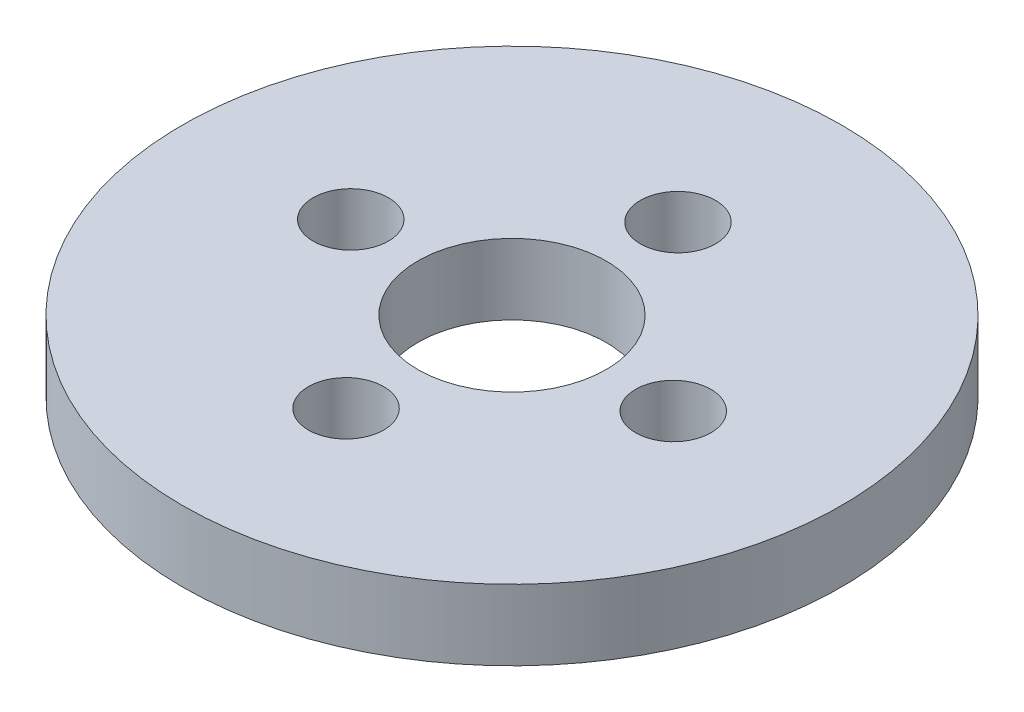
ISO-10303-21;
HEADER;
FILE_DESCRIPTION(('STEP AP214'),'2;1');
FILE_NAME('part.step','',(''),(''),'','','');
FILE_SCHEMA(('AUTOMOTIVE_DESIGN { 1 0 10303 214 1 1 1 1 }'));
ENDSEC;
DATA;
#1=APPLICATION_CONTEXT('core data for automotive mechanical design processes');
#2=APPLICATION_PROTOCOL_DEFINITION('international standard','automotive_design',2000,#1);
#3=PRODUCT_CONTEXT('',#1,'mechanical');
#4=PRODUCT('Part','Part','',(#3));
#5=PRODUCT_RELATED_PRODUCT_CATEGORY('part','',(#4));
#6=PRODUCT_DEFINITION_FORMATION('','',#4);
#7=PRODUCT_DEFINITION_CONTEXT('part definition',#1,'design');
#8=PRODUCT_DEFINITION('design','',#6,#7);
#9=PRODUCT_DEFINITION_SHAPE('','',#8);
#10=(LENGTH_UNIT() NAMED_UNIT(*) SI_UNIT(.MILLI.,.METRE.));
#11=(NAMED_UNIT(*) PLANE_ANGLE_UNIT() SI_UNIT($,.RADIAN.));
#12=(NAMED_UNIT(*) SI_UNIT($,.STERADIAN.) SOLID_ANGLE_UNIT());
#13=UNCERTAINTY_MEASURE_WITH_UNIT(LENGTH_MEASURE(1.E-05),#10,'distance_accuracy_value','');
#14=(GEOMETRIC_REPRESENTATION_CONTEXT(3) GLOBAL_UNCERTAINTY_ASSIGNED_CONTEXT((#13)) GLOBAL_UNIT_ASSIGNED_CONTEXT((#10,
#11,#12)) REPRESENTATION_CONTEXT('',''));
#15=CARTESIAN_POINT('',(0.,0.,0.));
#16=DIRECTION('',(0.,0.,1.));
#17=DIRECTION('',(1.,0.,0.));
#18=AXIS2_PLACEMENT_3D('',#15,#16,#17);
#19=CARTESIAN_POINT('',(0.,3.,0.));
#20=DIRECTION('',(0.,1.,0.));
#21=DIRECTION('',(0.,0.,1.));
#22=AXIS2_PLACEMENT_3D('',#19,#20,#21);
#23=PLANE('',#22);
#24=CARTESIAN_POINT('',(-0.100073178163242,3.,6.94996163937999));
#25=DIRECTION('',(0.,1.,0.));
#26=DIRECTION('',(0.,0.,1.));
#27=AXIS2_PLACEMENT_3D('',#24,#25,#26);
#28=CIRCLE('',#27,1.60000000000042);
#29=CARTESIAN_POINT('',(-0.100073178163242,3.,8.54996163938041));
#30=VERTEX_POINT('',#29);
#31=EDGE_CURVE('E61',#30,#30,#28,.T.);
#32=ORIENTED_EDGE('',*,*,#31,.F.);
#33=EDGE_LOOP('',(#32));
#34=FACE_BOUND('',#33,.T.);
#35=CARTESIAN_POINT('',(0.100073178163635,3.,-6.94996163937998));
#36=DIRECTION('',(0.,1.,0.));
#37=DIRECTION('',(0.,0.,1.));
#38=AXIS2_PLACEMENT_3D('',#35,#36,#37);
#39=CIRCLE('',#38,1.6);
#40=CARTESIAN_POINT('',(0.100073178163635,3.,-5.34996163937998));
#41=VERTEX_POINT('',#40);
#42=EDGE_CURVE('E49',#41,#41,#39,.T.);
#43=ORIENTED_EDGE('',*,*,#42,.F.);
#44=EDGE_LOOP('',(#43));
#45=FACE_BOUND('',#44,.T.);
#46=CARTESIAN_POINT('',(0.,3.,0.));
#47=DIRECTION('',(0.,1.,0.));
#48=DIRECTION('',(0.,0.,1.));
#49=AXIS2_PLACEMENT_3D('',#46,#47,#48);
#50=CIRCLE('',#49,14.);
#51=CARTESIAN_POINT('',(0.,3.,14.));
#52=VERTEX_POINT('',#51);
#53=EDGE_CURVE('E10',#52,#52,#50,.T.);
#54=ORIENTED_EDGE('',*,*,#53,.T.);
#55=EDGE_LOOP('',(#54));
#56=FACE_BOUND('',#55,.T.);
#57=CARTESIAN_POINT('',(0.,3.,0.));
#58=DIRECTION('',(0.,1.,0.));
#59=DIRECTION('',(0.,0.,1.));
#60=AXIS2_PLACEMENT_3D('',#57,#58,#59);
#61=CIRCLE('',#60,4.);
#62=CARTESIAN_POINT('',(0.,3.,4.));
#63=VERTEX_POINT('',#62);
#64=EDGE_CURVE('E44',#63,#63,#61,.T.);
#65=ORIENTED_EDGE('',*,*,#64,.F.);
#66=EDGE_LOOP('',(#65));
#67=FACE_BOUND('',#66,.T.);
#68=CARTESIAN_POINT('',(6.94996163938018,3.,0.100073178163441));
#69=DIRECTION('',(0.,1.,0.));
#70=DIRECTION('',(0.,0.,1.));
#71=AXIS2_PLACEMENT_3D('',#68,#69,#70);
#72=CIRCLE('',#71,1.60000000000015);
#73=CARTESIAN_POINT('',(6.94996163938018,3.,1.70007317816359));
#74=VERTEX_POINT('',#73);
#75=EDGE_CURVE('E55',#74,#74,#72,.T.);
#76=ORIENTED_EDGE('',*,*,#75,.F.);
#77=EDGE_LOOP('',(#76));
#78=FACE_BOUND('',#77,.T.);
#79=CARTESIAN_POINT('',(-6.94996163937979,3.,-0.100073178163435));
#80=DIRECTION('',(0.,1.,0.));
#81=DIRECTION('',(0.,0.,1.));
#82=AXIS2_PLACEMENT_3D('',#79,#80,#81);
#83=CIRCLE('',#82,1.60000000000032);
#84=CARTESIAN_POINT('',(-6.94996163937979,3.,1.49992682183688));
#85=VERTEX_POINT('',#84);
#86=EDGE_CURVE('E67',#85,#85,#83,.T.);
#87=ORIENTED_EDGE('',*,*,#86,.F.);
#88=EDGE_LOOP('',(#87));
#89=FACE_BOUND('',#88,.T.);
#90=ADVANCED_FACE('F33',(#34,#45,#56,#67,#78,#89),#23,.T.);
#91=CARTESIAN_POINT('',(0.,0.,0.));
#92=DIRECTION('',(0.,1.,0.));
#93=DIRECTION('',(0.,0.,1.));
#94=AXIS2_PLACEMENT_3D('',#91,#92,#93);
#95=PLANE('',#94);
#96=CARTESIAN_POINT('',(0.,0.,0.));
#97=DIRECTION('',(0.,1.,0.));
#98=DIRECTION('',(0.,0.,1.));
#99=AXIS2_PLACEMENT_3D('',#96,#97,#98);
#100=CIRCLE('',#99,14.);
#101=CARTESIAN_POINT('',(0.,0.,14.));
#102=VERTEX_POINT('',#101);
#103=EDGE_CURVE('E37',#102,#102,#100,.T.);
#104=ORIENTED_EDGE('',*,*,#103,.F.);
#105=EDGE_LOOP('',(#104));
#106=FACE_BOUND('',#105,.T.);
#107=CARTESIAN_POINT('',(0.,0.,0.));
#108=DIRECTION('',(0.,1.,0.));
#109=DIRECTION('',(0.,0.,1.));
#110=AXIS2_PLACEMENT_3D('',#107,#108,#109);
#111=CIRCLE('',#110,4.);
#112=CARTESIAN_POINT('',(0.,0.,4.));
#113=VERTEX_POINT('',#112);
#114=EDGE_CURVE('E46',#113,#113,#111,.T.);
#115=ORIENTED_EDGE('',*,*,#114,.T.);
#116=EDGE_LOOP('',(#115));
#117=FACE_BOUND('',#116,.T.);
#118=CARTESIAN_POINT('',(0.100073178163635,0.,-6.94996163937998));
#119=DIRECTION('',(0.,1.,0.));
#120=DIRECTION('',(0.,0.,1.));
#121=AXIS2_PLACEMENT_3D('',#118,#119,#120);
#122=CIRCLE('',#121,1.6);
#123=CARTESIAN_POINT('',(0.100073178163635,0.,-5.34996163937998));
#124=VERTEX_POINT('',#123);
#125=EDGE_CURVE('E52',#124,#124,#122,.T.);
#126=ORIENTED_EDGE('',*,*,#125,.T.);
#127=EDGE_LOOP('',(#126));
#128=FACE_BOUND('',#127,.T.);
#129=CARTESIAN_POINT('',(6.94996163938018,0.,0.100073178163441));
#130=DIRECTION('',(0.,1.,0.));
#131=DIRECTION('',(0.,0.,1.));
#132=AXIS2_PLACEMENT_3D('',#129,#130,#131);
#133=CIRCLE('',#132,1.60000000000015);
#134=CARTESIAN_POINT('',(6.94996163938018,0.,1.70007317816359));
#135=VERTEX_POINT('',#134);
#136=EDGE_CURVE('E58',#135,#135,#133,.T.);
#137=ORIENTED_EDGE('',*,*,#136,.T.);
#138=EDGE_LOOP('',(#137));
#139=FACE_BOUND('',#138,.T.);
#140=CARTESIAN_POINT('',(-0.100073178163242,0.,6.94996163937999));
#141=DIRECTION('',(0.,1.,0.));
#142=DIRECTION('',(0.,0.,1.));
#143=AXIS2_PLACEMENT_3D('',#140,#141,#142);
#144=CIRCLE('',#143,1.60000000000042);
#145=CARTESIAN_POINT('',(-0.100073178163242,0.,8.54996163938041));
#146=VERTEX_POINT('',#145);
#147=EDGE_CURVE('E64',#146,#146,#144,.T.);
#148=ORIENTED_EDGE('',*,*,#147,.T.);
#149=EDGE_LOOP('',(#148));
#150=FACE_BOUND('',#149,.T.);
#151=CARTESIAN_POINT('',(-6.94996163937979,0.,-0.100073178163435));
#152=DIRECTION('',(0.,1.,0.));
#153=DIRECTION('',(0.,0.,1.));
#154=AXIS2_PLACEMENT_3D('',#151,#152,#153);
#155=CIRCLE('',#154,1.60000000000032);
#156=CARTESIAN_POINT('',(-6.94996163937979,0.,1.49992682183688));
#157=VERTEX_POINT('',#156);
#158=EDGE_CURVE('E70',#157,#157,#155,.T.);
#159=ORIENTED_EDGE('',*,*,#158,.T.);
#160=EDGE_LOOP('',(#159));
#161=FACE_BOUND('',#160,.T.);
#162=ADVANCED_FACE('F80',(#106,#117,#128,#139,#150,#161),#95,.F.);
#163=CARTESIAN_POINT('',(0.,3.,0.));
#164=DIRECTION('',(0.,-1.,0.));
#165=DIRECTION('',(0.,0.,-1.));
#166=AXIS2_PLACEMENT_3D('',#163,#164,#165);
#167=CYLINDRICAL_SURFACE('',#166,14.);
#168=ORIENTED_EDGE('',*,*,#53,.F.);
#169=EDGE_LOOP('',(#168));
#170=FACE_BOUND('',#169,.T.);
#171=ORIENTED_EDGE('',*,*,#103,.T.);
#172=EDGE_LOOP('',(#171));
#173=FACE_BOUND('',#172,.T.);
#174=ADVANCED_FACE('F35',(#170,#173),#167,.T.);
#175=CARTESIAN_POINT('',(0.,3.,0.));
#176=DIRECTION('',(0.,-1.,0.));
#177=DIRECTION('',(0.,0.,-1.));
#178=AXIS2_PLACEMENT_3D('',#175,#176,#177);
#179=CYLINDRICAL_SURFACE('',#178,4.);
#180=ORIENTED_EDGE('',*,*,#64,.T.);
#181=EDGE_LOOP('',(#180));
#182=FACE_BOUND('',#181,.T.);
#183=ORIENTED_EDGE('',*,*,#114,.F.);
#184=EDGE_LOOP('',(#183));
#185=FACE_BOUND('',#184,.T.);
#186=ADVANCED_FACE('F90',(#182,#185),#179,.F.);
#187=CARTESIAN_POINT('',(0.100073178163635,3.,-6.94996163937998));
#188=DIRECTION('',(0.,-1.,0.));
#189=DIRECTION('',(0.,0.,-1.));
#190=AXIS2_PLACEMENT_3D('',#187,#188,#189);
#191=CYLINDRICAL_SURFACE('',#190,1.6);
#192=ORIENTED_EDGE('',*,*,#42,.T.);
#193=EDGE_LOOP('',(#192));
#194=FACE_BOUND('',#193,.T.);
#195=ORIENTED_EDGE('',*,*,#125,.F.);
#196=EDGE_LOOP('',(#195));
#197=FACE_BOUND('',#196,.T.);
#198=ADVANCED_FACE('F93',(#194,#197),#191,.F.);
#199=CARTESIAN_POINT('',(6.94996163938018,3.,0.100073178163441));
#200=DIRECTION('',(0.,-1.,0.));
#201=DIRECTION('',(0.,0.,-1.));
#202=AXIS2_PLACEMENT_3D('',#199,#200,#201);
#203=CYLINDRICAL_SURFACE('',#202,1.60000000000015);
#204=ORIENTED_EDGE('',*,*,#75,.T.);
#205=EDGE_LOOP('',(#204));
#206=FACE_BOUND('',#205,.T.);
#207=ORIENTED_EDGE('',*,*,#136,.F.);
#208=EDGE_LOOP('',(#207));
#209=FACE_BOUND('',#208,.T.);
#210=ADVANCED_FACE('F97',(#206,#209),#203,.F.);
#211=CARTESIAN_POINT('',(-0.100073178163242,3.,6.94996163937999));
#212=DIRECTION('',(0.,-1.,0.));
#213=DIRECTION('',(0.,0.,-1.));
#214=AXIS2_PLACEMENT_3D('',#211,#212,#213);
#215=CYLINDRICAL_SURFACE('',#214,1.60000000000042);
#216=ORIENTED_EDGE('',*,*,#31,.T.);
#217=EDGE_LOOP('',(#216));
#218=FACE_BOUND('',#217,.T.);
#219=ORIENTED_EDGE('',*,*,#147,.F.);
#220=EDGE_LOOP('',(#219));
#221=FACE_BOUND('',#220,.T.);
#222=ADVANCED_FACE('F101',(#218,#221),#215,.F.);
#223=CARTESIAN_POINT('',(-6.94996163937979,3.,-0.100073178163435));
#224=DIRECTION('',(0.,-1.,0.));
#225=DIRECTION('',(0.,0.,-1.));
#226=AXIS2_PLACEMENT_3D('',#223,#224,#225);
#227=CYLINDRICAL_SURFACE('',#226,1.60000000000032);
#228=ORIENTED_EDGE('',*,*,#86,.T.);
#229=EDGE_LOOP('',(#228));
#230=FACE_BOUND('',#229,.T.);
#231=ORIENTED_EDGE('',*,*,#158,.F.);
#232=EDGE_LOOP('',(#231));
#233=FACE_BOUND('',#232,.T.);
#234=ADVANCED_FACE('F76',(#230,#233),#227,.F.);
#235=CLOSED_SHELL('',(#90,#162,#174,#186,#198,#210,#222,#234));
#236=MANIFOLD_SOLID_BREP('B2',#235);
#237=ADVANCED_BREP_SHAPE_REPRESENTATION('',(#18,#236),#14);
#238=SHAPE_DEFINITION_REPRESENTATION(#9,#237);
ENDSEC;
END-ISO-10303-21;
